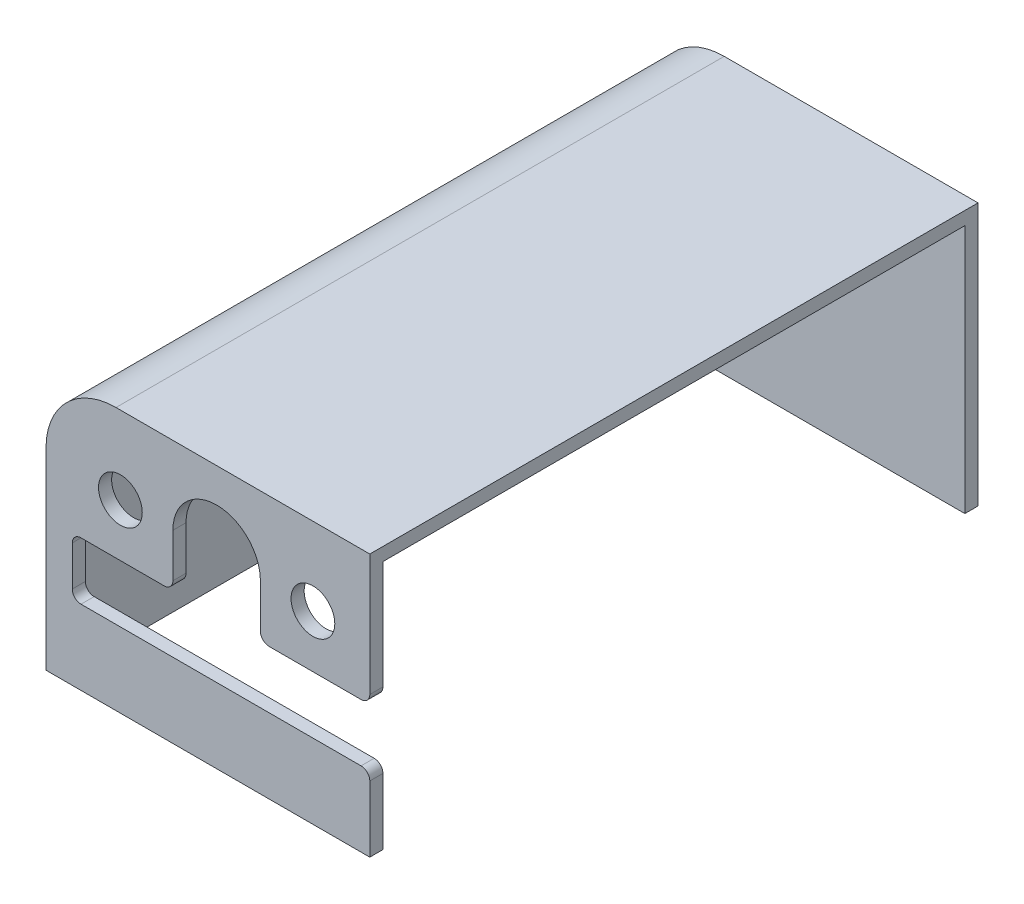
ISO-10303-21;
HEADER;
FILE_DESCRIPTION(('STEP AP214'),'2;1');
FILE_NAME('part.step','',(''),(''),'','','');
FILE_SCHEMA(('AUTOMOTIVE_DESIGN { 1 0 10303 214 1 1 1 1 }'));
ENDSEC;
DATA;
#1=APPLICATION_CONTEXT('core data for automotive mechanical design processes');
#2=APPLICATION_PROTOCOL_DEFINITION('international standard','automotive_design',2000,#1);
#3=PRODUCT_CONTEXT('',#1,'mechanical');
#4=PRODUCT('Part','Part','',(#3));
#5=PRODUCT_RELATED_PRODUCT_CATEGORY('part','',(#4));
#6=PRODUCT_DEFINITION_FORMATION('','',#4);
#7=PRODUCT_DEFINITION_CONTEXT('part definition',#1,'design');
#8=PRODUCT_DEFINITION('design','',#6,#7);
#9=PRODUCT_DEFINITION_SHAPE('','',#8);
#10=(LENGTH_UNIT() NAMED_UNIT(*) SI_UNIT(.MILLI.,.METRE.));
#11=(NAMED_UNIT(*) PLANE_ANGLE_UNIT() SI_UNIT($,.RADIAN.));
#12=(NAMED_UNIT(*) SI_UNIT($,.STERADIAN.) SOLID_ANGLE_UNIT());
#13=UNCERTAINTY_MEASURE_WITH_UNIT(LENGTH_MEASURE(1.E-05),#10,'distance_accuracy_value','');
#14=(GEOMETRIC_REPRESENTATION_CONTEXT(3) GLOBAL_UNCERTAINTY_ASSIGNED_CONTEXT((#13)) GLOBAL_UNIT_ASSIGNED_CONTEXT((#10,
#11,#12)) REPRESENTATION_CONTEXT('',''));
#15=CARTESIAN_POINT('',(0.,0.,0.));
#16=DIRECTION('',(0.,0.,1.));
#17=DIRECTION('',(1.,0.,0.));
#18=AXIS2_PLACEMENT_3D('',#15,#16,#17);
#19=CARTESIAN_POINT('',(17.5,15.,-37.));
#20=DIRECTION('',(-1.,0.,0.));
#21=DIRECTION('',(0.,0.,1.));
#22=AXIS2_PLACEMENT_3D('',#19,#20,#21);
#23=PLANE('',#22);
#24=DIRECTION('',(0.,1.,0.));
#25=VECTOR('',#24,1.);
#26=CARTESIAN_POINT('',(17.5,0.,32.4999999999999));
#27=LINE('',#26,#25);
#28=CARTESIAN_POINT('',(17.5,16.1,32.4999999999999));
#29=VERTEX_POINT('',#28);
#30=CARTESIAN_POINT('',(17.5,30.,32.4999999999999));
#31=VERTEX_POINT('',#30);
#32=EDGE_CURVE('E327',#29,#31,#27,.T.);
#33=ORIENTED_EDGE('',*,*,#32,.F.);
#34=DIRECTION('',(0.,0.,1.));
#35=VECTOR('',#34,1.);
#36=CARTESIAN_POINT('',(17.5,16.1,30.9999999999999));
#37=LINE('',#36,#35);
#38=CARTESIAN_POINT('',(17.5,16.1,30.9999999999999));
#39=VERTEX_POINT('',#38);
#40=EDGE_CURVE('E426',#29,#39,#37,.F.);
#41=ORIENTED_EDGE('',*,*,#40,.T.);
#42=DIRECTION('',(0.,1.,0.));
#43=VECTOR('',#42,1.);
#44=CARTESIAN_POINT('',(17.5,0.,30.9999999999999));
#45=LINE('',#44,#43);
#46=CARTESIAN_POINT('',(17.5,28.5,30.9999999999999));
#47=VERTEX_POINT('',#46);
#48=EDGE_CURVE('E335',#39,#47,#45,.T.);
#49=ORIENTED_EDGE('',*,*,#48,.T.);
#50=DIRECTION('',(0.,0.,-1.));
#51=VECTOR('',#50,1.);
#52=CARTESIAN_POINT('',(17.5,28.5,-37.));
#53=LINE('',#52,#51);
#54=CARTESIAN_POINT('',(17.5,28.5,-35.5));
#55=VERTEX_POINT('',#54);
#56=EDGE_CURVE('E304',#47,#55,#53,.T.);
#57=ORIENTED_EDGE('',*,*,#56,.T.);
#58=DIRECTION('',(0.,-1.,0.));
#59=VECTOR('',#58,1.);
#60=CARTESIAN_POINT('',(17.5,15.,-35.5));
#61=LINE('',#60,#59);
#62=CARTESIAN_POINT('',(17.5,0.,-35.5));
#63=VERTEX_POINT('',#62);
#64=EDGE_CURVE('E357',#55,#63,#61,.T.);
#65=ORIENTED_EDGE('',*,*,#64,.T.);
#66=DIRECTION('',(0.,0.,-1.));
#67=VECTOR('',#66,1.);
#68=CARTESIAN_POINT('',(17.5,0.,-37.));
#69=LINE('',#68,#67);
#70=CARTESIAN_POINT('',(17.5,0.,-37.));
#71=VERTEX_POINT('',#70);
#72=EDGE_CURVE('E343',#63,#71,#69,.T.);
#73=ORIENTED_EDGE('',*,*,#72,.T.);
#74=DIRECTION('',(0.,-1.,0.));
#75=VECTOR('',#74,1.);
#76=CARTESIAN_POINT('',(17.5,15.,-37.));
#77=LINE('',#76,#75);
#78=CARTESIAN_POINT('',(17.5,30.,-37.));
#79=VERTEX_POINT('',#78);
#80=EDGE_CURVE('E364',#79,#71,#77,.T.);
#81=ORIENTED_EDGE('',*,*,#80,.F.);
#82=DIRECTION('',(0.,0.,-1.));
#83=VECTOR('',#82,1.);
#84=CARTESIAN_POINT('',(17.5,30.,-37.));
#85=LINE('',#84,#83);
#86=EDGE_CURVE('E306',#31,#79,#85,.T.);
#87=ORIENTED_EDGE('',*,*,#86,.F.);
#88=EDGE_LOOP('',(#33,#41,#49,#57,#65,#73,#81,#87));
#89=FACE_BOUND('',#88,.T.);
#90=ADVANCED_FACE('F87',(#89),#23,.F.);
#91=CARTESIAN_POINT('',(0.,0.,32.4999999999999));
#92=DIRECTION('',(0.,0.,1.));
#93=DIRECTION('',(1.,0.,0.));
#94=AXIS2_PLACEMENT_3D('',#91,#92,#93);
#95=PLANE('',#94);
#96=CARTESIAN_POINT('',(-11.,21.1,32.4999999999999));
#97=DIRECTION('',(0.,0.,1.));
#98=DIRECTION('',(1.,0.,0.));
#99=AXIS2_PLACEMENT_3D('',#96,#97,#98);
#100=CIRCLE('',#99,2.5);
#101=CARTESIAN_POINT('',(-8.5,21.1,32.4999999999999));
#102=VERTEX_POINT('',#101);
#103=EDGE_CURVE('E451',#102,#102,#100,.T.);
#104=ORIENTED_EDGE('',*,*,#103,.F.);
#105=EDGE_LOOP('',(#104));
#106=FACE_BOUND('',#105,.T.);
#107=CARTESIAN_POINT('',(11.,21.1,32.4999999999999));
#108=DIRECTION('',(0.,0.,1.));
#109=DIRECTION('',(1.,0.,0.));
#110=AXIS2_PLACEMENT_3D('',#107,#108,#109);
#111=CIRCLE('',#110,2.5);
#112=CARTESIAN_POINT('',(13.5,21.1,32.4999999999999));
#113=VERTEX_POINT('',#112);
#114=EDGE_CURVE('E454',#113,#113,#111,.T.);
#115=ORIENTED_EDGE('',*,*,#114,.F.);
#116=EDGE_LOOP('',(#115));
#117=FACE_BOUND('',#116,.T.);
#118=CARTESIAN_POINT('',(17.5,0.,32.4999999999999));
#119=VERTEX_POINT('',#118);
#120=CARTESIAN_POINT('',(17.5,7.53719171047401,32.4999999999999));
#121=VERTEX_POINT('',#120);
#122=EDGE_CURVE('E336',#119,#121,#27,.T.);
#123=ORIENTED_EDGE('',*,*,#122,.T.);
#124=CARTESIAN_POINT('',(16.5,7.53719171047401,32.4999999999999));
#125=DIRECTION('',(0.,0.,1.));
#126=DIRECTION('',(1.,0.,0.));
#127=AXIS2_PLACEMENT_3D('',#124,#125,#126);
#128=CIRCLE('',#127,1.);
#129=CARTESIAN_POINT('',(16.5,8.53719171047401,32.4999999999999));
#130=VERTEX_POINT('',#129);
#131=EDGE_CURVE('E394',#121,#130,#128,.T.);
#132=ORIENTED_EDGE('',*,*,#131,.T.);
#133=DIRECTION('',(1.,0.,0.));
#134=VECTOR('',#133,1.);
#135=CARTESIAN_POINT('',(0.,8.53719171047401,32.4999999999999));
#136=LINE('',#135,#134);
#137=CARTESIAN_POINT('',(-15.5,8.53719171047401,32.4999999999999));
#138=VERTEX_POINT('',#137);
#139=EDGE_CURVE('E301',#138,#130,#136,.T.);
#140=ORIENTED_EDGE('',*,*,#139,.F.);
#141=CARTESIAN_POINT('',(-15.5,9.53719171047401,32.4999999999999));
#142=DIRECTION('',(0.,0.,1.));
#143=DIRECTION('',(1.,0.,0.));
#144=AXIS2_PLACEMENT_3D('',#141,#142,#143);
#145=CIRCLE('',#144,1.);
#146=CARTESIAN_POINT('',(-16.5,9.53719171047401,32.4999999999999));
#147=VERTEX_POINT('',#146);
#148=EDGE_CURVE('E428',#138,#147,#145,.F.);
#149=ORIENTED_EDGE('',*,*,#148,.T.);
#150=DIRECTION('',(0.,-1.,0.));
#151=VECTOR('',#150,1.);
#152=CARTESIAN_POINT('',(-16.5,0.,32.4999999999999));
#153=LINE('',#152,#151);
#154=CARTESIAN_POINT('',(-16.5,14.1,32.4999999999999));
#155=VERTEX_POINT('',#154);
#156=EDGE_CURVE('E299',#155,#147,#153,.T.);
#157=ORIENTED_EDGE('',*,*,#156,.F.);
#158=CARTESIAN_POINT('',(-15.5,14.1,32.4999999999999));
#159=DIRECTION('',(0.,0.,1.));
#160=DIRECTION('',(1.,0.,0.));
#161=AXIS2_PLACEMENT_3D('',#158,#159,#160);
#162=CIRCLE('',#161,1.);
#163=CARTESIAN_POINT('',(-15.5,15.1,32.4999999999999));
#164=VERTEX_POINT('',#163);
#165=EDGE_CURVE('E96',#155,#164,#162,.F.);
#166=ORIENTED_EDGE('',*,*,#165,.T.);
#167=DIRECTION('',(1.,0.,0.));
#168=VECTOR('',#167,1.);
#169=CARTESIAN_POINT('',(0.,15.1,32.4999999999999));
#170=LINE('',#169,#168);
#171=CARTESIAN_POINT('',(-6.,15.1,32.4999999999999));
#172=VERTEX_POINT('',#171);
#173=EDGE_CURVE('E296',#164,#172,#170,.T.);
#174=ORIENTED_EDGE('',*,*,#173,.T.);
#175=CARTESIAN_POINT('',(-6.,16.1,32.4999999999999));
#176=DIRECTION('',(0.,0.,1.));
#177=DIRECTION('',(1.,0.,0.));
#178=AXIS2_PLACEMENT_3D('',#175,#176,#177);
#179=CIRCLE('',#178,1.);
#180=CARTESIAN_POINT('',(-5.,16.1,32.4999999999999));
#181=VERTEX_POINT('',#180);
#182=EDGE_CURVE('E392',#172,#181,#179,.T.);
#183=ORIENTED_EDGE('',*,*,#182,.T.);
#184=DIRECTION('',(0.,-1.,0.));
#185=VECTOR('',#184,1.);
#186=CARTESIAN_POINT('',(-5.,0.,32.4999999999999));
#187=LINE('',#186,#185);
#188=CARTESIAN_POINT('',(-5.,21.1,32.4999999999999));
#189=VERTEX_POINT('',#188);
#190=EDGE_CURVE('E293',#189,#181,#187,.T.);
#191=ORIENTED_EDGE('',*,*,#190,.F.);
#192=CARTESIAN_POINT('',(0.,21.1,32.4999999999999));
#193=DIRECTION('',(0.,0.,1.));
#194=DIRECTION('',(1.,0.,0.));
#195=AXIS2_PLACEMENT_3D('',#192,#193,#194);
#196=CIRCLE('',#195,5.);
#197=CARTESIAN_POINT('',(5.,21.1,32.4999999999999));
#198=VERTEX_POINT('',#197);
#199=EDGE_CURVE('E290',#198,#189,#196,.T.);
#200=ORIENTED_EDGE('',*,*,#199,.F.);
#201=DIRECTION('',(0.,1.,0.));
#202=VECTOR('',#201,1.);
#203=CARTESIAN_POINT('',(5.,0.,32.4999999999999));
#204=LINE('',#203,#202);
#205=CARTESIAN_POINT('',(5.,16.1,32.4999999999999));
#206=VERTEX_POINT('',#205);
#207=EDGE_CURVE('E268',#206,#198,#204,.T.);
#208=ORIENTED_EDGE('',*,*,#207,.F.);
#209=CARTESIAN_POINT('',(6.,16.1,32.4999999999999));
#210=DIRECTION('',(0.,0.,1.));
#211=DIRECTION('',(1.,0.,0.));
#212=AXIS2_PLACEMENT_3D('',#209,#210,#211);
#213=CIRCLE('',#212,1.);
#214=CARTESIAN_POINT('',(6.,15.1,32.4999999999999));
#215=VERTEX_POINT('',#214);
#216=EDGE_CURVE('E390',#206,#215,#213,.T.);
#217=ORIENTED_EDGE('',*,*,#216,.T.);
#218=CARTESIAN_POINT('',(16.5,15.1,32.4999999999999));
#219=VERTEX_POINT('',#218);
#220=EDGE_CURVE('E262',#215,#219,#170,.T.);
#221=ORIENTED_EDGE('',*,*,#220,.T.);
#222=CARTESIAN_POINT('',(16.5,16.1,32.4999999999999));
#223=DIRECTION('',(0.,0.,1.));
#224=DIRECTION('',(1.,0.,0.));
#225=AXIS2_PLACEMENT_3D('',#222,#223,#224);
#226=CIRCLE('',#225,1.);
#227=EDGE_CURVE('E388',#219,#29,#226,.T.);
#228=ORIENTED_EDGE('',*,*,#227,.T.);
#229=ORIENTED_EDGE('',*,*,#32,.T.);
#230=DIRECTION('',(1.,0.,0.));
#231=VECTOR('',#230,1.);
#232=CARTESIAN_POINT('',(17.5,30.,32.4999999999999));
#233=LINE('',#232,#231);
#234=CARTESIAN_POINT('',(-11.5,30.,32.4999999999999));
#235=VERTEX_POINT('',#234);
#236=EDGE_CURVE('E312',#235,#31,#233,.T.);
#237=ORIENTED_EDGE('',*,*,#236,.F.);
#238=CARTESIAN_POINT('',(-11.5,22.,32.4999999999999));
#239=DIRECTION('',(0.,0.,1.));
#240=DIRECTION('',(1.,0.,0.));
#241=AXIS2_PLACEMENT_3D('',#238,#239,#240);
#242=CIRCLE('',#241,8.);
#243=CARTESIAN_POINT('',(-19.5,22.,32.4999999999999));
#244=VERTEX_POINT('',#243);
#245=EDGE_CURVE('E379',#235,#244,#242,.T.);
#246=ORIENTED_EDGE('',*,*,#245,.T.);
#247=DIRECTION('',(0.,1.,0.));
#248=VECTOR('',#247,1.);
#249=CARTESIAN_POINT('',(-19.5,0.,32.4999999999999));
#250=LINE('',#249,#248);
#251=CARTESIAN_POINT('',(-19.5,0.,32.4999999999999));
#252=VERTEX_POINT('',#251);
#253=EDGE_CURVE('E340',#252,#244,#250,.T.);
#254=ORIENTED_EDGE('',*,*,#253,.F.);
#255=DIRECTION('',(1.,0.,0.));
#256=VECTOR('',#255,1.);
#257=CARTESIAN_POINT('',(0.,0.,32.4999999999999));
#258=LINE('',#257,#256);
#259=EDGE_CURVE('E331',#252,#119,#258,.T.);
#260=ORIENTED_EDGE('',*,*,#259,.T.);
#261=EDGE_LOOP('',(#123,#132,#140,#149,#157,#166,#174,#183,#191,#200,#208,#217,#221,#228,#229,
#237,#246,#254,#260));
#262=FACE_BOUND('',#261,.T.);
#263=ADVANCED_FACE('F464',(#106,#117,#262),#95,.T.);
#264=CARTESIAN_POINT('',(-18.,0.,30.9999999999999));
#265=DIRECTION('',(0.,0.,-1.));
#266=DIRECTION('',(-1.,0.,0.));
#267=AXIS2_PLACEMENT_3D('',#264,#265,#266);
#268=PLANE('',#267);
#269=CARTESIAN_POINT('',(-11.,21.1,30.9999999999999));
#270=DIRECTION('',(0.,0.,1.));
#271=DIRECTION('',(1.,0.,0.));
#272=AXIS2_PLACEMENT_3D('',#269,#270,#271);
#273=CIRCLE('',#272,2.5);
#274=CARTESIAN_POINT('',(-8.5,21.1,30.9999999999999));
#275=VERTEX_POINT('',#274);
#276=EDGE_CURVE('E457',#275,#275,#273,.T.);
#277=ORIENTED_EDGE('',*,*,#276,.T.);
#278=EDGE_LOOP('',(#277));
#279=FACE_BOUND('',#278,.T.);
#280=CARTESIAN_POINT('',(11.,21.1,30.9999999999999));
#281=DIRECTION('',(0.,0.,1.));
#282=DIRECTION('',(1.,0.,0.));
#283=AXIS2_PLACEMENT_3D('',#280,#281,#282);
#284=CIRCLE('',#283,2.5);
#285=CARTESIAN_POINT('',(13.5,21.1,30.9999999999999));
#286=VERTEX_POINT('',#285);
#287=EDGE_CURVE('E291',#286,#286,#284,.T.);
#288=ORIENTED_EDGE('',*,*,#287,.T.);
#289=EDGE_LOOP('',(#288));
#290=FACE_BOUND('',#289,.T.);
#291=DIRECTION('',(1.,0.,0.));
#292=VECTOR('',#291,1.);
#293=CARTESIAN_POINT('',(0.,8.53719171047401,30.9999999999999));
#294=LINE('',#293,#292);
#295=CARTESIAN_POINT('',(-15.5,8.53719171047401,30.9999999999999));
#296=VERTEX_POINT('',#295);
#297=CARTESIAN_POINT('',(16.5,8.53719171047401,30.9999999999999));
#298=VERTEX_POINT('',#297);
#299=EDGE_CURVE('E287',#296,#298,#294,.T.);
#300=ORIENTED_EDGE('',*,*,#299,.T.);
#301=CARTESIAN_POINT('',(16.5,7.53719171047401,30.9999999999999));
#302=DIRECTION('',(0.,0.,-1.));
#303=DIRECTION('',(-1.,0.,0.));
#304=AXIS2_PLACEMENT_3D('',#301,#302,#303);
#305=CIRCLE('',#304,1.);
#306=CARTESIAN_POINT('',(17.5,7.53719171047401,30.9999999999999));
#307=VERTEX_POINT('',#306);
#308=EDGE_CURVE('E406',#298,#307,#305,.T.);
#309=ORIENTED_EDGE('',*,*,#308,.T.);
#310=CARTESIAN_POINT('',(17.5,0.,30.9999999999999));
#311=VERTEX_POINT('',#310);
#312=EDGE_CURVE('E332',#311,#307,#45,.T.);
#313=ORIENTED_EDGE('',*,*,#312,.F.);
#314=DIRECTION('',(-1.,0.,0.));
#315=VECTOR('',#314,1.);
#316=CARTESIAN_POINT('',(-18.,0.,30.9999999999999));
#317=LINE('',#316,#315);
#318=CARTESIAN_POINT('',(-18.,0.,30.9999999999999));
#319=VERTEX_POINT('',#318);
#320=EDGE_CURVE('E325',#311,#319,#317,.T.);
#321=ORIENTED_EDGE('',*,*,#320,.T.);
#322=DIRECTION('',(0.,1.,0.));
#323=VECTOR('',#322,1.);
#324=CARTESIAN_POINT('',(-18.,0.,30.9999999999999));
#325=LINE('',#324,#323);
#326=CARTESIAN_POINT('',(-18.,20.5,30.9999999999999));
#327=VERTEX_POINT('',#326);
#328=EDGE_CURVE('E328',#319,#327,#325,.T.);
#329=ORIENTED_EDGE('',*,*,#328,.T.);
#330=CARTESIAN_POINT('',(-9.99999999999999,20.5,30.9999999999999));
#331=DIRECTION('',(0.,0.,-1.));
#332=DIRECTION('',(-1.,0.,0.));
#333=AXIS2_PLACEMENT_3D('',#330,#331,#332);
#334=CIRCLE('',#333,8.);
#335=CARTESIAN_POINT('',(-9.99999999999999,28.5,30.9999999999999));
#336=VERTEX_POINT('',#335);
#337=EDGE_CURVE('E374',#327,#336,#334,.T.);
#338=ORIENTED_EDGE('',*,*,#337,.T.);
#339=DIRECTION('',(-1.,0.,0.));
#340=VECTOR('',#339,1.);
#341=CARTESIAN_POINT('',(17.5,28.5,30.9999999999999));
#342=LINE('',#341,#340);
#343=EDGE_CURVE('E315',#47,#336,#342,.T.);
#344=ORIENTED_EDGE('',*,*,#343,.F.);
#345=ORIENTED_EDGE('',*,*,#48,.F.);
#346=CARTESIAN_POINT('',(16.5,16.1,30.9999999999999));
#347=DIRECTION('',(0.,0.,-1.));
#348=DIRECTION('',(-1.,0.,0.));
#349=AXIS2_PLACEMENT_3D('',#346,#347,#348);
#350=CIRCLE('',#349,1.);
#351=CARTESIAN_POINT('',(16.5,15.1,30.9999999999999));
#352=VERTEX_POINT('',#351);
#353=EDGE_CURVE('E401',#39,#352,#350,.T.);
#354=ORIENTED_EDGE('',*,*,#353,.T.);
#355=DIRECTION('',(1.,0.,0.));
#356=VECTOR('',#355,1.);
#357=CARTESIAN_POINT('',(0.,15.1,30.9999999999999));
#358=LINE('',#357,#356);
#359=CARTESIAN_POINT('',(6.,15.1,30.9999999999999));
#360=VERTEX_POINT('',#359);
#361=EDGE_CURVE('E273',#360,#352,#358,.T.);
#362=ORIENTED_EDGE('',*,*,#361,.F.);
#363=CARTESIAN_POINT('',(6.,16.1,30.9999999999999));
#364=DIRECTION('',(0.,0.,-1.));
#365=DIRECTION('',(-1.,0.,0.));
#366=AXIS2_PLACEMENT_3D('',#363,#364,#365);
#367=CIRCLE('',#366,1.);
#368=CARTESIAN_POINT('',(5.,16.1,30.9999999999999));
#369=VERTEX_POINT('',#368);
#370=EDGE_CURVE('E258',#360,#369,#367,.T.);
#371=ORIENTED_EDGE('',*,*,#370,.T.);
#372=DIRECTION('',(0.,1.,0.));
#373=VECTOR('',#372,1.);
#374=CARTESIAN_POINT('',(5.,0.,30.9999999999999));
#375=LINE('',#374,#373);
#376=CARTESIAN_POINT('',(5.,21.1,30.9999999999999));
#377=VERTEX_POINT('',#376);
#378=EDGE_CURVE('E249',#369,#377,#375,.T.);
#379=ORIENTED_EDGE('',*,*,#378,.T.);
#380=CARTESIAN_POINT('',(0.,21.1,30.9999999999999));
#381=DIRECTION('',(0.,0.,1.));
#382=DIRECTION('',(1.,0.,0.));
#383=AXIS2_PLACEMENT_3D('',#380,#381,#382);
#384=CIRCLE('',#383,5.);
#385=CARTESIAN_POINT('',(-5.,21.1,30.9999999999999));
#386=VERTEX_POINT('',#385);
#387=EDGE_CURVE('E255',#377,#386,#384,.T.);
#388=ORIENTED_EDGE('',*,*,#387,.T.);
#389=DIRECTION('',(0.,-1.,0.));
#390=VECTOR('',#389,1.);
#391=CARTESIAN_POINT('',(-5.,0.,30.9999999999999));
#392=LINE('',#391,#390);
#393=CARTESIAN_POINT('',(-5.,16.1,30.9999999999999));
#394=VERTEX_POINT('',#393);
#395=EDGE_CURVE('E277',#386,#394,#392,.T.);
#396=ORIENTED_EDGE('',*,*,#395,.T.);
#397=CARTESIAN_POINT('',(-6.,16.1,30.9999999999999));
#398=DIRECTION('',(0.,0.,-1.));
#399=DIRECTION('',(-1.,0.,0.));
#400=AXIS2_PLACEMENT_3D('',#397,#398,#399);
#401=CIRCLE('',#400,1.);
#402=CARTESIAN_POINT('',(-6.,15.1,30.9999999999999));
#403=VERTEX_POINT('',#402);
#404=EDGE_CURVE('E404',#394,#403,#401,.T.);
#405=ORIENTED_EDGE('',*,*,#404,.T.);
#406=CARTESIAN_POINT('',(-15.5,15.1,30.9999999999999));
#407=VERTEX_POINT('',#406);
#408=EDGE_CURVE('E279',#407,#403,#358,.T.);
#409=ORIENTED_EDGE('',*,*,#408,.F.);
#410=CARTESIAN_POINT('',(-15.5,14.1,30.9999999999999));
#411=DIRECTION('',(0.,0.,-1.));
#412=DIRECTION('',(-1.,0.,0.));
#413=AXIS2_PLACEMENT_3D('',#410,#411,#412);
#414=CIRCLE('',#413,1.);
#415=CARTESIAN_POINT('',(-16.5,14.1,30.9999999999999));
#416=VERTEX_POINT('',#415);
#417=EDGE_CURVE('E12',#407,#416,#414,.F.);
#418=ORIENTED_EDGE('',*,*,#417,.T.);
#419=DIRECTION('',(0.,-1.,0.));
#420=VECTOR('',#419,1.);
#421=CARTESIAN_POINT('',(-16.5,0.,30.9999999999999));
#422=LINE('',#421,#420);
#423=CARTESIAN_POINT('',(-16.5,9.53719171047401,30.9999999999999));
#424=VERTEX_POINT('',#423);
#425=EDGE_CURVE('E285',#416,#424,#422,.T.);
#426=ORIENTED_EDGE('',*,*,#425,.T.);
#427=CARTESIAN_POINT('',(-15.5,9.53719171047401,30.9999999999999));
#428=DIRECTION('',(0.,0.,-1.));
#429=DIRECTION('',(-1.,0.,0.));
#430=AXIS2_PLACEMENT_3D('',#427,#428,#429);
#431=CIRCLE('',#430,1.);
#432=EDGE_CURVE('E430',#424,#296,#431,.F.);
#433=ORIENTED_EDGE('',*,*,#432,.T.);
#434=EDGE_LOOP('',(#300,#309,#313,#321,#329,#338,#344,#345,#354,#362,#371,#379,#388,#396,#405,
#409,#418,#426,#433));
#435=FACE_BOUND('',#434,.T.);
#436=ADVANCED_FACE('F252',(#279,#290,#435),#268,.T.);
#437=CARTESIAN_POINT('',(-19.5,15.,-37.));
#438=DIRECTION('',(1.,0.,0.));
#439=DIRECTION('',(0.,0.,-1.));
#440=AXIS2_PLACEMENT_3D('',#437,#438,#439);
#441=PLANE('',#440);
#442=CARTESIAN_POINT('',(-19.5,1.50000000000028,25.0000000000002));
#443=DIRECTION('',(1.,0.,0.));
#444=DIRECTION('',(0.,0.,-1.));
#445=AXIS2_PLACEMENT_3D('',#442,#443,#444);
#446=CIRCLE('',#445,0.749999999999998);
#447=CARTESIAN_POINT('',(-19.5,1.50000000000028,24.2500000000002));
#448=VERTEX_POINT('',#447);
#449=EDGE_CURVE('E448',#448,#448,#446,.T.);
#450=ORIENTED_EDGE('',*,*,#449,.T.);
#451=EDGE_LOOP('',(#450));
#452=FACE_BOUND('',#451,.T.);
#453=CARTESIAN_POINT('',(-19.5,1.50000000000028,2.3811020722698E-13));
#454=DIRECTION('',(1.,0.,0.));
#455=DIRECTION('',(0.,0.,-1.));
#456=AXIS2_PLACEMENT_3D('',#453,#454,#455);
#457=CIRCLE('',#456,0.750000000000001);
#458=CARTESIAN_POINT('',(-19.5,1.50000000000028,-0.749999999999763));
#459=VERTEX_POINT('',#458);
#460=EDGE_CURVE('E438',#459,#459,#457,.T.);
#461=ORIENTED_EDGE('',*,*,#460,.T.);
#462=EDGE_LOOP('',(#461));
#463=FACE_BOUND('',#462,.T.);
#464=CARTESIAN_POINT('',(-19.5,1.50000000000028,-24.9999999999998));
#465=DIRECTION('',(1.,0.,0.));
#466=DIRECTION('',(0.,0.,-1.));
#467=AXIS2_PLACEMENT_3D('',#464,#465,#466);
#468=CIRCLE('',#467,0.749999999999998);
#469=CARTESIAN_POINT('',(-19.5,1.50000000000028,-25.7499999999998));
#470=VERTEX_POINT('',#469);
#471=EDGE_CURVE('E435',#470,#470,#468,.T.);
#472=ORIENTED_EDGE('',*,*,#471,.T.);
#473=EDGE_LOOP('',(#472));
#474=FACE_BOUND('',#473,.T.);
#475=ORIENTED_EDGE('',*,*,#253,.T.);
#476=DIRECTION('',(0.,0.,1.));
#477=VECTOR('',#476,1.);
#478=CARTESIAN_POINT('',(-19.5,22.,-37.));
#479=LINE('',#478,#477);
#480=CARTESIAN_POINT('',(-19.5,22.,-37.));
#481=VERTEX_POINT('',#480);
#482=EDGE_CURVE('E381',#244,#481,#479,.F.);
#483=ORIENTED_EDGE('',*,*,#482,.T.);
#484=DIRECTION('',(0.,-1.,0.));
#485=VECTOR('',#484,1.);
#486=CARTESIAN_POINT('',(-19.5,15.,-37.));
#487=LINE('',#486,#485);
#488=CARTESIAN_POINT('',(-19.5,0.,-37.));
#489=VERTEX_POINT('',#488);
#490=EDGE_CURVE('E362',#481,#489,#487,.T.);
#491=ORIENTED_EDGE('',*,*,#490,.T.);
#492=DIRECTION('',(0.,0.,1.));
#493=VECTOR('',#492,1.);
#494=CARTESIAN_POINT('',(-19.5,0.,-37.));
#495=LINE('',#494,#493);
#496=EDGE_CURVE('E349',#489,#252,#495,.T.);
#497=ORIENTED_EDGE('',*,*,#496,.T.);
#498=EDGE_LOOP('',(#475,#483,#491,#497));
#499=FACE_BOUND('',#498,.T.);
#500=ADVANCED_FACE('F546',(#452,#463,#474,#499),#441,.F.);
#501=CARTESIAN_POINT('',(-18.,15.,-35.5));
#502=DIRECTION('',(-1.,0.,0.));
#503=DIRECTION('',(0.,0.,1.));
#504=AXIS2_PLACEMENT_3D('',#501,#502,#503);
#505=PLANE('',#504);
#506=CARTESIAN_POINT('',(-18.,1.50000000000028,25.0000000000002));
#507=DIRECTION('',(-1.,0.,0.));
#508=DIRECTION('',(0.,0.,1.));
#509=AXIS2_PLACEMENT_3D('',#506,#507,#508);
#510=CIRCLE('',#509,0.749999999999998);
#511=CARTESIAN_POINT('',(-18.,1.50000000000028,25.7500000000002));
#512=VERTEX_POINT('',#511);
#513=EDGE_CURVE('E91',#512,#512,#510,.T.);
#514=ORIENTED_EDGE('',*,*,#513,.T.);
#515=EDGE_LOOP('',(#514));
#516=FACE_BOUND('',#515,.T.);
#517=CARTESIAN_POINT('',(-18.,1.50000000000028,2.3811020722698E-13));
#518=DIRECTION('',(-1.,0.,0.));
#519=DIRECTION('',(0.,0.,1.));
#520=AXIS2_PLACEMENT_3D('',#517,#518,#519);
#521=CIRCLE('',#520,0.750000000000001);
#522=CARTESIAN_POINT('',(-18.,1.50000000000028,0.750000000000239));
#523=VERTEX_POINT('',#522);
#524=EDGE_CURVE('E436',#523,#523,#521,.T.);
#525=ORIENTED_EDGE('',*,*,#524,.T.);
#526=EDGE_LOOP('',(#525));
#527=FACE_BOUND('',#526,.T.);
#528=CARTESIAN_POINT('',(-18.,1.50000000000028,-24.9999999999998));
#529=DIRECTION('',(-1.,0.,0.));
#530=DIRECTION('',(0.,0.,1.));
#531=AXIS2_PLACEMENT_3D('',#528,#529,#530);
#532=CIRCLE('',#531,0.749999999999998);
#533=CARTESIAN_POINT('',(-18.,1.50000000000028,-24.2499999999998));
#534=VERTEX_POINT('',#533);
#535=EDGE_CURVE('E433',#534,#534,#532,.T.);
#536=ORIENTED_EDGE('',*,*,#535,.T.);
#537=EDGE_LOOP('',(#536));
#538=FACE_BOUND('',#537,.T.);
#539=DIRECTION('',(0.,-1.,0.));
#540=VECTOR('',#539,1.);
#541=CARTESIAN_POINT('',(-18.,15.,-35.5));
#542=LINE('',#541,#540);
#543=CARTESIAN_POINT('',(-18.,20.5,-35.5));
#544=VERTEX_POINT('',#543);
#545=CARTESIAN_POINT('',(-18.,0.,-35.5));
#546=VERTEX_POINT('',#545);
#547=EDGE_CURVE('E360',#544,#546,#542,.T.);
#548=ORIENTED_EDGE('',*,*,#547,.F.);
#549=DIRECTION('',(0.,0.,-1.));
#550=VECTOR('',#549,1.);
#551=CARTESIAN_POINT('',(-18.,20.5,-35.5));
#552=LINE('',#551,#550);
#553=EDGE_CURVE('E372',#544,#327,#552,.F.);
#554=ORIENTED_EDGE('',*,*,#553,.T.);
#555=ORIENTED_EDGE('',*,*,#328,.F.);
#556=DIRECTION('',(0.,0.,-1.));
#557=VECTOR('',#556,1.);
#558=CARTESIAN_POINT('',(-18.,0.,-35.5));
#559=LINE('',#558,#557);
#560=EDGE_CURVE('E352',#319,#546,#559,.T.);
#561=ORIENTED_EDGE('',*,*,#560,.T.);
#562=EDGE_LOOP('',(#548,#554,#555,#561));
#563=FACE_BOUND('',#562,.T.);
#564=ADVANCED_FACE('F487',(#516,#527,#538,#563),#505,.F.);
#565=CARTESIAN_POINT('',(0.,0.,0.));
#566=DIRECTION('',(0.,-1.,0.));
#567=DIRECTION('',(0.,0.,-1.));
#568=AXIS2_PLACEMENT_3D('',#565,#566,#567);
#569=PLANE('',#568);
#570=ORIENTED_EDGE('',*,*,#560,.F.);
#571=ORIENTED_EDGE('',*,*,#320,.F.);
#572=DIRECTION('',(0.,0.,-1.));
#573=VECTOR('',#572,1.);
#574=CARTESIAN_POINT('',(17.5,0.,32.4999999999999));
#575=LINE('',#574,#573);
#576=EDGE_CURVE('E322',#119,#311,#575,.T.);
#577=ORIENTED_EDGE('',*,*,#576,.F.);
#578=ORIENTED_EDGE('',*,*,#259,.F.);
#579=ORIENTED_EDGE('',*,*,#496,.F.);
#580=DIRECTION('',(-1.,0.,0.));
#581=VECTOR('',#580,1.);
#582=CARTESIAN_POINT('',(17.5,0.,-37.));
#583=LINE('',#582,#581);
#584=EDGE_CURVE('E346',#71,#489,#583,.T.);
#585=ORIENTED_EDGE('',*,*,#584,.F.);
#586=ORIENTED_EDGE('',*,*,#72,.F.);
#587=DIRECTION('',(1.,0.,0.));
#588=VECTOR('',#587,1.);
#589=CARTESIAN_POINT('',(17.5,0.,-35.5));
#590=LINE('',#589,#588);
#591=EDGE_CURVE('E355',#546,#63,#590,.T.);
#592=ORIENTED_EDGE('',*,*,#591,.F.);
#593=EDGE_LOOP('',(#570,#571,#577,#578,#579,#585,#586,#592));
#594=FACE_BOUND('',#593,.T.);
#595=ADVANCED_FACE('F480',(#594),#569,.T.);
#596=ORIENTED_EDGE('',*,*,#312,.T.);
#597=DIRECTION('',(0.,0.,1.));
#598=VECTOR('',#597,1.);
#599=CARTESIAN_POINT('',(17.5,7.53719171047401,-37.));
#600=LINE('',#599,#598);
#601=EDGE_CURVE('E385',#307,#121,#600,.T.);
#602=ORIENTED_EDGE('',*,*,#601,.T.);
#603=ORIENTED_EDGE('',*,*,#122,.F.);
#604=ORIENTED_EDGE('',*,*,#576,.T.);
#605=EDGE_LOOP('',(#596,#602,#603,#604));
#606=FACE_BOUND('',#605,.T.);
#607=ADVANCED_FACE('F475',(#606),#23,.F.);
#608=CARTESIAN_POINT('',(17.5,15.,-37.));
#609=DIRECTION('',(0.,0.,1.));
#610=DIRECTION('',(1.,0.,0.));
#611=AXIS2_PLACEMENT_3D('',#608,#609,#610);
#612=PLANE('',#611);
#613=ORIENTED_EDGE('',*,*,#490,.F.);
#614=CARTESIAN_POINT('',(-11.5,22.,-37.));
#615=DIRECTION('',(0.,0.,1.));
#616=DIRECTION('',(1.,0.,0.));
#617=AXIS2_PLACEMENT_3D('',#614,#615,#616);
#618=CIRCLE('',#617,8.);
#619=CARTESIAN_POINT('',(-11.5,30.,-37.));
#620=VERTEX_POINT('',#619);
#621=EDGE_CURVE('E383',#481,#620,#618,.F.);
#622=ORIENTED_EDGE('',*,*,#621,.T.);
#623=DIRECTION('',(-1.,0.,0.));
#624=VECTOR('',#623,1.);
#625=CARTESIAN_POINT('',(17.5,30.,-37.));
#626=LINE('',#625,#624);
#627=EDGE_CURVE('E309',#79,#620,#626,.T.);
#628=ORIENTED_EDGE('',*,*,#627,.F.);
#629=ORIENTED_EDGE('',*,*,#80,.T.);
#630=ORIENTED_EDGE('',*,*,#584,.T.);
#631=EDGE_LOOP('',(#613,#622,#628,#629,#630));
#632=FACE_BOUND('',#631,.T.);
#633=ADVANCED_FACE('F532',(#632),#612,.F.);
#634=CARTESIAN_POINT('',(17.5,15.,-35.5));
#635=DIRECTION('',(0.,0.,-1.));
#636=DIRECTION('',(-1.,0.,0.));
#637=AXIS2_PLACEMENT_3D('',#634,#635,#636);
#638=PLANE('',#637);
#639=DIRECTION('',(1.,0.,0.));
#640=VECTOR('',#639,1.);
#641=CARTESIAN_POINT('',(-18.,28.5,-35.5));
#642=LINE('',#641,#640);
#643=CARTESIAN_POINT('',(-10.,28.5,-35.5));
#644=VERTEX_POINT('',#643);
#645=EDGE_CURVE('E320',#644,#55,#642,.T.);
#646=ORIENTED_EDGE('',*,*,#645,.F.);
#647=CARTESIAN_POINT('',(-10.,20.5,-35.5));
#648=DIRECTION('',(0.,0.,-1.));
#649=DIRECTION('',(-1.,0.,0.));
#650=AXIS2_PLACEMENT_3D('',#647,#648,#649);
#651=CIRCLE('',#650,8.);
#652=EDGE_CURVE('E370',#644,#544,#651,.F.);
#653=ORIENTED_EDGE('',*,*,#652,.T.);
#654=ORIENTED_EDGE('',*,*,#547,.T.);
#655=ORIENTED_EDGE('',*,*,#591,.T.);
#656=ORIENTED_EDGE('',*,*,#64,.F.);
#657=EDGE_LOOP('',(#646,#653,#654,#655,#656));
#658=FACE_BOUND('',#657,.T.);
#659=ADVANCED_FACE('F538',(#658),#638,.F.);
#660=CARTESIAN_POINT('',(0.,30.,0.));
#661=DIRECTION('',(0.,-1.,0.));
#662=DIRECTION('',(0.,0.,-1.));
#663=AXIS2_PLACEMENT_3D('',#660,#661,#662);
#664=PLANE('',#663);
#665=ORIENTED_EDGE('',*,*,#627,.T.);
#666=DIRECTION('',(0.,0.,1.));
#667=VECTOR('',#666,1.);
#668=CARTESIAN_POINT('',(-11.5,30.,0.));
#669=LINE('',#668,#667);
#670=EDGE_CURVE('E376',#620,#235,#669,.T.);
#671=ORIENTED_EDGE('',*,*,#670,.T.);
#672=ORIENTED_EDGE('',*,*,#236,.T.);
#673=ORIENTED_EDGE('',*,*,#86,.T.);
#674=EDGE_LOOP('',(#665,#671,#672,#673));
#675=FACE_BOUND('',#674,.T.);
#676=ADVANCED_FACE('F552',(#675),#664,.F.);
#677=CARTESIAN_POINT('',(0.,28.5,0.));
#678=DIRECTION('',(0.,-1.,0.));
#679=DIRECTION('',(0.,0.,-1.));
#680=AXIS2_PLACEMENT_3D('',#677,#678,#679);
#681=PLANE('',#680);
#682=ORIENTED_EDGE('',*,*,#343,.T.);
#683=DIRECTION('',(0.,0.,-1.));
#684=VECTOR('',#683,1.);
#685=CARTESIAN_POINT('',(-10.,28.5,0.));
#686=LINE('',#685,#684);
#687=EDGE_CURVE('E367',#336,#644,#686,.T.);
#688=ORIENTED_EDGE('',*,*,#687,.T.);
#689=ORIENTED_EDGE('',*,*,#645,.T.);
#690=ORIENTED_EDGE('',*,*,#56,.F.);
#691=EDGE_LOOP('',(#682,#688,#689,#690));
#692=FACE_BOUND('',#691,.T.);
#693=ADVANCED_FACE('F496',(#692),#681,.T.);
#694=CARTESIAN_POINT('',(-10.,20.5,0.));
#695=DIRECTION('',(0.,0.,-1.));
#696=DIRECTION('',(-1.,0.,0.));
#697=AXIS2_PLACEMENT_3D('',#694,#695,#696);
#698=CYLINDRICAL_SURFACE('',#697,8.);
#699=ORIENTED_EDGE('',*,*,#337,.F.);
#700=ORIENTED_EDGE('',*,*,#553,.F.);
#701=ORIENTED_EDGE('',*,*,#652,.F.);
#702=ORIENTED_EDGE('',*,*,#687,.F.);
#703=EDGE_LOOP('',(#699,#700,#701,#702));
#704=FACE_BOUND('',#703,.T.);
#705=ADVANCED_FACE('F490',(#704),#698,.F.);
#706=CARTESIAN_POINT('',(-11.5,22.,0.));
#707=DIRECTION('',(0.,0.,1.));
#708=DIRECTION('',(1.,0.,0.));
#709=AXIS2_PLACEMENT_3D('',#706,#707,#708);
#710=CYLINDRICAL_SURFACE('',#709,8.);
#711=ORIENTED_EDGE('',*,*,#621,.F.);
#712=ORIENTED_EDGE('',*,*,#482,.F.);
#713=ORIENTED_EDGE('',*,*,#245,.F.);
#714=ORIENTED_EDGE('',*,*,#670,.F.);
#715=EDGE_LOOP('',(#711,#712,#713,#714));
#716=FACE_BOUND('',#715,.T.);
#717=ADVANCED_FACE('F568',(#716),#710,.T.);
#718=CARTESIAN_POINT('',(5.,0.,30.9999999999999));
#719=DIRECTION('',(1.,0.,0.));
#720=DIRECTION('',(0.,1.,0.));
#721=AXIS2_PLACEMENT_3D('',#718,#719,#720);
#722=PLANE('',#721);
#723=ORIENTED_EDGE('',*,*,#378,.F.);
#724=DIRECTION('',(0.,0.,1.));
#725=VECTOR('',#724,1.);
#726=CARTESIAN_POINT('',(5.,16.1,32.4999999999999));
#727=LINE('',#726,#725);
#728=EDGE_CURVE('E419',#369,#206,#727,.T.);
#729=ORIENTED_EDGE('',*,*,#728,.T.);
#730=ORIENTED_EDGE('',*,*,#207,.T.);
#731=DIRECTION('',(0.,0.,1.));
#732=VECTOR('',#731,1.);
#733=CARTESIAN_POINT('',(5.,21.1,30.9999999999999));
#734=LINE('',#733,#732);
#735=EDGE_CURVE('E265',#377,#198,#734,.T.);
#736=ORIENTED_EDGE('',*,*,#735,.F.);
#737=EDGE_LOOP('',(#723,#729,#730,#736));
#738=FACE_BOUND('',#737,.T.);
#739=ADVANCED_FACE('F266',(#738),#722,.F.);
#740=CARTESIAN_POINT('',(0.,15.1,30.9999999999999));
#741=DIRECTION('',(0.,-1.,0.));
#742=DIRECTION('',(0.,0.,-1.));
#743=AXIS2_PLACEMENT_3D('',#740,#741,#742);
#744=PLANE('',#743);
#745=ORIENTED_EDGE('',*,*,#220,.F.);
#746=DIRECTION('',(0.,0.,1.));
#747=VECTOR('',#746,1.);
#748=CARTESIAN_POINT('',(6.,15.1,30.9999999999999));
#749=LINE('',#748,#747);
#750=EDGE_CURVE('E424',#215,#360,#749,.F.);
#751=ORIENTED_EDGE('',*,*,#750,.T.);
#752=ORIENTED_EDGE('',*,*,#361,.T.);
#753=DIRECTION('',(0.,0.,1.));
#754=VECTOR('',#753,1.);
#755=CARTESIAN_POINT('',(16.5,15.1,32.4999999999999));
#756=LINE('',#755,#754);
#757=EDGE_CURVE('E421',#352,#219,#756,.T.);
#758=ORIENTED_EDGE('',*,*,#757,.T.);
#759=EDGE_LOOP('',(#745,#751,#752,#758));
#760=FACE_BOUND('',#759,.T.);
#761=ADVANCED_FACE('F510',(#760),#744,.T.);
#762=CARTESIAN_POINT('',(0.,8.53719171047401,30.9999999999999));
#763=DIRECTION('',(0.,-1.,0.));
#764=DIRECTION('',(0.,0.,-1.));
#765=AXIS2_PLACEMENT_3D('',#762,#763,#764);
#766=PLANE('',#765);
#767=ORIENTED_EDGE('',*,*,#139,.T.);
#768=DIRECTION('',(0.,0.,1.));
#769=VECTOR('',#768,1.);
#770=CARTESIAN_POINT('',(16.5,8.53719171047401,30.9999999999999));
#771=LINE('',#770,#769);
#772=EDGE_CURVE('E399',#130,#298,#771,.F.);
#773=ORIENTED_EDGE('',*,*,#772,.T.);
#774=ORIENTED_EDGE('',*,*,#299,.F.);
#775=DIRECTION('',(0.,0.,1.));
#776=VECTOR('',#775,1.);
#777=CARTESIAN_POINT('',(-15.5,8.53719171047401,32.4999999999999));
#778=LINE('',#777,#776);
#779=EDGE_CURVE('E396',#296,#138,#778,.T.);
#780=ORIENTED_EDGE('',*,*,#779,.T.);
#781=EDGE_LOOP('',(#767,#773,#774,#780));
#782=FACE_BOUND('',#781,.T.);
#783=ADVANCED_FACE('F594',(#782),#766,.F.);
#784=CARTESIAN_POINT('',(-16.5,0.,30.9999999999999));
#785=DIRECTION('',(-1.,0.,0.));
#786=DIRECTION('',(0.,0.,1.));
#787=AXIS2_PLACEMENT_3D('',#784,#785,#786);
#788=PLANE('',#787);
#789=ORIENTED_EDGE('',*,*,#156,.T.);
#790=DIRECTION('',(0.,0.,1.));
#791=VECTOR('',#790,1.);
#792=CARTESIAN_POINT('',(-16.5,9.53719171047401,30.9999999999999));
#793=LINE('',#792,#791);
#794=EDGE_CURVE('E104',#147,#424,#793,.F.);
#795=ORIENTED_EDGE('',*,*,#794,.T.);
#796=ORIENTED_EDGE('',*,*,#425,.F.);
#797=DIRECTION('',(0.,0.,1.));
#798=VECTOR('',#797,1.);
#799=CARTESIAN_POINT('',(-16.5,14.1,30.9999999999999));
#800=LINE('',#799,#798);
#801=EDGE_CURVE('E408',#416,#155,#800,.T.);
#802=ORIENTED_EDGE('',*,*,#801,.T.);
#803=EDGE_LOOP('',(#789,#795,#796,#802));
#804=FACE_BOUND('',#803,.T.);
#805=ADVANCED_FACE('F591',(#804),#788,.F.);
#806=ORIENTED_EDGE('',*,*,#173,.F.);
#807=DIRECTION('',(0.,0.,1.));
#808=VECTOR('',#807,1.);
#809=CARTESIAN_POINT('',(-15.5,15.1,30.9999999999999));
#810=LINE('',#809,#808);
#811=EDGE_CURVE('E415',#164,#407,#810,.F.);
#812=ORIENTED_EDGE('',*,*,#811,.T.);
#813=ORIENTED_EDGE('',*,*,#408,.T.);
#814=DIRECTION('',(0.,0.,1.));
#815=VECTOR('',#814,1.);
#816=CARTESIAN_POINT('',(-6.,15.1,32.4999999999999));
#817=LINE('',#816,#815);
#818=EDGE_CURVE('E412',#403,#172,#817,.T.);
#819=ORIENTED_EDGE('',*,*,#818,.T.);
#820=EDGE_LOOP('',(#806,#812,#813,#819));
#821=FACE_BOUND('',#820,.T.);
#822=ADVANCED_FACE('F589',(#821),#744,.T.);
#823=CARTESIAN_POINT('',(-5.,0.,30.9999999999999));
#824=DIRECTION('',(-1.,0.,0.));
#825=DIRECTION('',(0.,0.,1.));
#826=AXIS2_PLACEMENT_3D('',#823,#824,#825);
#827=PLANE('',#826);
#828=ORIENTED_EDGE('',*,*,#190,.T.);
#829=DIRECTION('',(0.,0.,1.));
#830=VECTOR('',#829,1.);
#831=CARTESIAN_POINT('',(-5.,16.1,30.9999999999999));
#832=LINE('',#831,#830);
#833=EDGE_CURVE('E417',#181,#394,#832,.F.);
#834=ORIENTED_EDGE('',*,*,#833,.T.);
#835=ORIENTED_EDGE('',*,*,#395,.F.);
#836=DIRECTION('',(0.,0.,1.));
#837=VECTOR('',#836,1.);
#838=CARTESIAN_POINT('',(-5.,21.1,30.9999999999999));
#839=LINE('',#838,#837);
#840=EDGE_CURVE('E272',#386,#189,#839,.T.);
#841=ORIENTED_EDGE('',*,*,#840,.T.);
#842=EDGE_LOOP('',(#828,#834,#835,#841));
#843=FACE_BOUND('',#842,.T.);
#844=ADVANCED_FACE('F586',(#843),#827,.F.);
#845=CARTESIAN_POINT('',(0.,21.1,30.9999999999999));
#846=DIRECTION('',(0.,0.,1.));
#847=DIRECTION('',(1.,0.,0.));
#848=AXIS2_PLACEMENT_3D('',#845,#846,#847);
#849=CYLINDRICAL_SURFACE('',#848,5.);
#850=ORIENTED_EDGE('',*,*,#199,.T.);
#851=ORIENTED_EDGE('',*,*,#840,.F.);
#852=ORIENTED_EDGE('',*,*,#387,.F.);
#853=ORIENTED_EDGE('',*,*,#735,.T.);
#854=EDGE_LOOP('',(#850,#851,#852,#853));
#855=FACE_BOUND('',#854,.T.);
#856=ADVANCED_FACE('F276',(#855),#849,.F.);
#857=CARTESIAN_POINT('',(11.,21.1,30.9999999999999));
#858=DIRECTION('',(0.,0.,1.));
#859=DIRECTION('',(1.,0.,0.));
#860=AXIS2_PLACEMENT_3D('',#857,#858,#859);
#861=CYLINDRICAL_SURFACE('',#860,2.5);
#862=ORIENTED_EDGE('',*,*,#287,.F.);
#863=EDGE_LOOP('',(#862));
#864=FACE_BOUND('',#863,.T.);
#865=ORIENTED_EDGE('',*,*,#114,.T.);
#866=EDGE_LOOP('',(#865));
#867=FACE_BOUND('',#866,.T.);
#868=ADVANCED_FACE('F585',(#864,#867),#861,.F.);
#869=CARTESIAN_POINT('',(-11.,21.1,30.9999999999999));
#870=DIRECTION('',(0.,0.,1.));
#871=DIRECTION('',(1.,0.,0.));
#872=AXIS2_PLACEMENT_3D('',#869,#870,#871);
#873=CYLINDRICAL_SURFACE('',#872,2.5);
#874=ORIENTED_EDGE('',*,*,#276,.F.);
#875=EDGE_LOOP('',(#874));
#876=FACE_BOUND('',#875,.T.);
#877=ORIENTED_EDGE('',*,*,#103,.T.);
#878=EDGE_LOOP('',(#877));
#879=FACE_BOUND('',#878,.T.);
#880=ADVANCED_FACE('F462',(#876,#879),#873,.F.);
#881=CARTESIAN_POINT('',(16.5,7.53719171047401,-37.));
#882=DIRECTION('',(0.,0.,1.));
#883=DIRECTION('',(1.,0.,0.));
#884=AXIS2_PLACEMENT_3D('',#881,#882,#883);
#885=CYLINDRICAL_SURFACE('',#884,1.);
#886=ORIENTED_EDGE('',*,*,#308,.F.);
#887=ORIENTED_EDGE('',*,*,#772,.F.);
#888=ORIENTED_EDGE('',*,*,#131,.F.);
#889=ORIENTED_EDGE('',*,*,#601,.F.);
#890=EDGE_LOOP('',(#886,#887,#888,#889));
#891=FACE_BOUND('',#890,.T.);
#892=ADVANCED_FACE('F602',(#891),#885,.T.);
#893=CARTESIAN_POINT('',(-15.5,9.53719171047401,30.9999999999999));
#894=DIRECTION('',(0.,0.,-1.));
#895=DIRECTION('',(-1.,0.,0.));
#896=AXIS2_PLACEMENT_3D('',#893,#894,#895);
#897=CYLINDRICAL_SURFACE('',#896,1.);
#898=ORIENTED_EDGE('',*,*,#432,.F.);
#899=ORIENTED_EDGE('',*,*,#794,.F.);
#900=ORIENTED_EDGE('',*,*,#148,.F.);
#901=ORIENTED_EDGE('',*,*,#779,.F.);
#902=EDGE_LOOP('',(#898,#899,#900,#901));
#903=FACE_BOUND('',#902,.T.);
#904=ADVANCED_FACE('F655',(#903),#897,.F.);
#905=CARTESIAN_POINT('',(-15.5,14.1,30.9999999999999));
#906=DIRECTION('',(0.,0.,1.));
#907=DIRECTION('',(1.,0.,0.));
#908=AXIS2_PLACEMENT_3D('',#905,#906,#907);
#909=CYLINDRICAL_SURFACE('',#908,1.);
#910=ORIENTED_EDGE('',*,*,#417,.F.);
#911=ORIENTED_EDGE('',*,*,#811,.F.);
#912=ORIENTED_EDGE('',*,*,#165,.F.);
#913=ORIENTED_EDGE('',*,*,#801,.F.);
#914=EDGE_LOOP('',(#910,#911,#912,#913));
#915=FACE_BOUND('',#914,.T.);
#916=ADVANCED_FACE('F521',(#915),#909,.F.);
#917=CARTESIAN_POINT('',(-6.,16.1,30.9999999999999));
#918=DIRECTION('',(0.,0.,-1.));
#919=DIRECTION('',(-1.,0.,0.));
#920=AXIS2_PLACEMENT_3D('',#917,#918,#919);
#921=CYLINDRICAL_SURFACE('',#920,1.);
#922=ORIENTED_EDGE('',*,*,#404,.F.);
#923=ORIENTED_EDGE('',*,*,#833,.F.);
#924=ORIENTED_EDGE('',*,*,#182,.F.);
#925=ORIENTED_EDGE('',*,*,#818,.F.);
#926=EDGE_LOOP('',(#922,#923,#924,#925));
#927=FACE_BOUND('',#926,.T.);
#928=ADVANCED_FACE('F515',(#927),#921,.T.);
#929=CARTESIAN_POINT('',(6.,16.1,30.9999999999999));
#930=DIRECTION('',(0.,0.,-1.));
#931=DIRECTION('',(-1.,0.,0.));
#932=AXIS2_PLACEMENT_3D('',#929,#930,#931);
#933=CYLINDRICAL_SURFACE('',#932,1.);
#934=ORIENTED_EDGE('',*,*,#370,.F.);
#935=ORIENTED_EDGE('',*,*,#750,.F.);
#936=ORIENTED_EDGE('',*,*,#216,.F.);
#937=ORIENTED_EDGE('',*,*,#728,.F.);
#938=EDGE_LOOP('',(#934,#935,#936,#937));
#939=FACE_BOUND('',#938,.T.);
#940=ADVANCED_FACE('F513',(#939),#933,.T.);
#941=CARTESIAN_POINT('',(16.5,16.1,30.9999999999999));
#942=DIRECTION('',(0.,0.,-1.));
#943=DIRECTION('',(-1.,0.,0.));
#944=AXIS2_PLACEMENT_3D('',#941,#942,#943);
#945=CYLINDRICAL_SURFACE('',#944,1.);
#946=ORIENTED_EDGE('',*,*,#353,.F.);
#947=ORIENTED_EDGE('',*,*,#40,.F.);
#948=ORIENTED_EDGE('',*,*,#227,.F.);
#949=ORIENTED_EDGE('',*,*,#757,.F.);
#950=EDGE_LOOP('',(#946,#947,#948,#949));
#951=FACE_BOUND('',#950,.T.);
#952=ADVANCED_FACE('F89',(#951),#945,.T.);
#953=CARTESIAN_POINT('',(17.5,1.50000000000028,-24.9999999999998));
#954=DIRECTION('',(-1.,0.,0.));
#955=DIRECTION('',(0.,0.,1.));
#956=AXIS2_PLACEMENT_3D('',#953,#954,#955);
#957=CYLINDRICAL_SURFACE('',#956,0.749999999999998);
#958=ORIENTED_EDGE('',*,*,#535,.F.);
#959=EDGE_LOOP('',(#958));
#960=FACE_BOUND('',#959,.T.);
#961=ORIENTED_EDGE('',*,*,#471,.F.);
#962=EDGE_LOOP('',(#961));
#963=FACE_BOUND('',#962,.T.);
#964=ADVANCED_FACE('F520',(#960,#963),#957,.F.);
#965=CARTESIAN_POINT('',(17.5,1.50000000000028,2.3811020722698E-13));
#966=DIRECTION('',(-1.,0.,0.));
#967=DIRECTION('',(0.,0.,1.));
#968=AXIS2_PLACEMENT_3D('',#965,#966,#967);
#969=CYLINDRICAL_SURFACE('',#968,0.750000000000001);
#970=ORIENTED_EDGE('',*,*,#524,.F.);
#971=EDGE_LOOP('',(#970));
#972=FACE_BOUND('',#971,.T.);
#973=ORIENTED_EDGE('',*,*,#460,.F.);
#974=EDGE_LOOP('',(#973));
#975=FACE_BOUND('',#974,.T.);
#976=ADVANCED_FACE('F609',(#972,#975),#969,.F.);
#977=CARTESIAN_POINT('',(17.5,1.50000000000028,25.0000000000002));
#978=DIRECTION('',(-1.,0.,0.));
#979=DIRECTION('',(0.,0.,1.));
#980=AXIS2_PLACEMENT_3D('',#977,#978,#979);
#981=CYLINDRICAL_SURFACE('',#980,0.749999999999998);
#982=ORIENTED_EDGE('',*,*,#513,.F.);
#983=EDGE_LOOP('',(#982));
#984=FACE_BOUND('',#983,.T.);
#985=ORIENTED_EDGE('',*,*,#449,.F.);
#986=EDGE_LOOP('',(#985));
#987=FACE_BOUND('',#986,.T.);
#988=ADVANCED_FACE('F613',(#984,#987),#981,.F.);
#989=CLOSED_SHELL('',(#90,#263,#436,#500,#564,#595,#607,#633,#659,#676,#693,#705,#717,#739,#761,
#783,#805,#822,#844,#856,#868,#880,#892,#904,#916,#928,#940,#952,#964,#976,#988));
#990=MANIFOLD_SOLID_BREP('B2',#989);
#991=ADVANCED_BREP_SHAPE_REPRESENTATION('',(#18,#990),#14);
#992=SHAPE_DEFINITION_REPRESENTATION(#9,#991);
ENDSEC;
END-ISO-10303-21;
